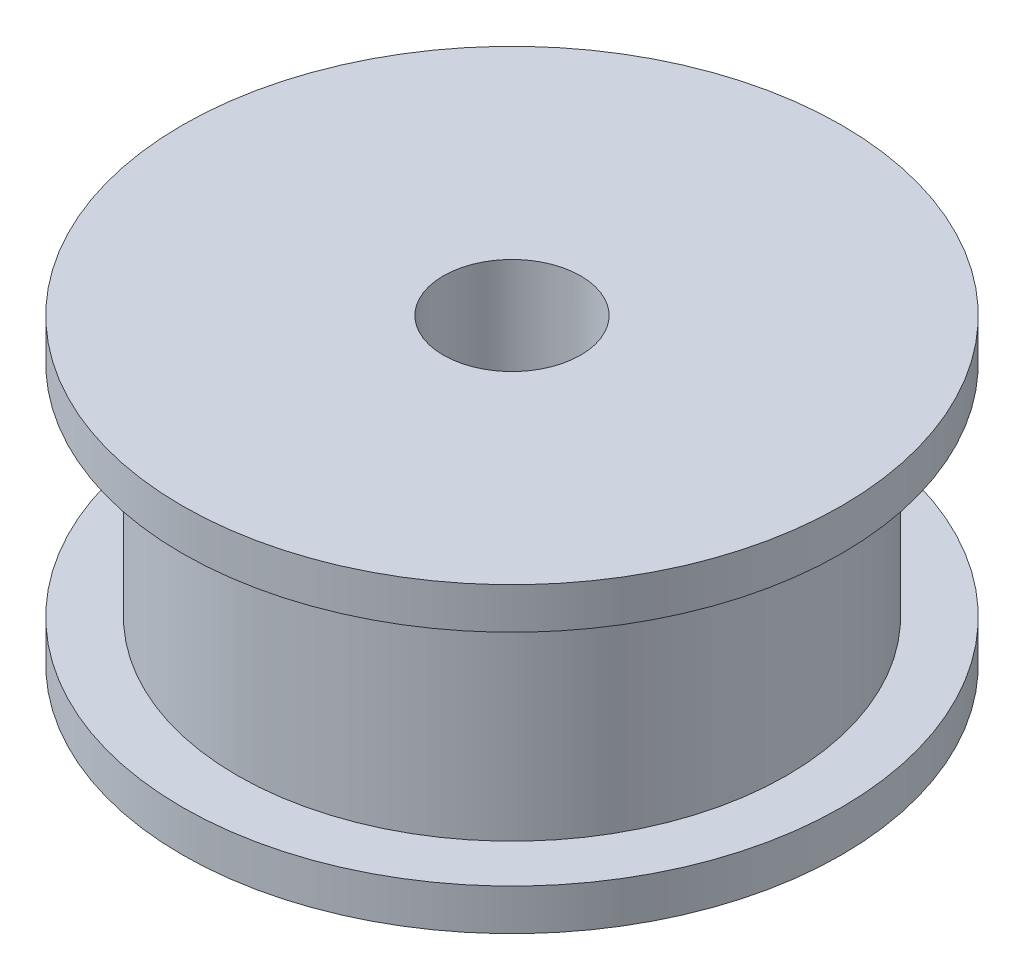
ISO-10303-21;
HEADER;
FILE_DESCRIPTION(('STEP AP214'),'2;1');
FILE_NAME('part.step','',(''),(''),'','','');
FILE_SCHEMA(('AUTOMOTIVE_DESIGN { 1 0 10303 214 1 1 1 1 }'));
ENDSEC;
DATA;
#1=APPLICATION_CONTEXT('core data for automotive mechanical design processes');
#2=APPLICATION_PROTOCOL_DEFINITION('international standard','automotive_design',2000,#1);
#3=PRODUCT_CONTEXT('',#1,'mechanical');
#4=PRODUCT('Part','Part','',(#3));
#5=PRODUCT_RELATED_PRODUCT_CATEGORY('part','',(#4));
#6=PRODUCT_DEFINITION_FORMATION('','',#4);
#7=PRODUCT_DEFINITION_CONTEXT('part definition',#1,'design');
#8=PRODUCT_DEFINITION('design','',#6,#7);
#9=PRODUCT_DEFINITION_SHAPE('','',#8);
#10=(LENGTH_UNIT() NAMED_UNIT(*) SI_UNIT(.MILLI.,.METRE.));
#11=(NAMED_UNIT(*) PLANE_ANGLE_UNIT() SI_UNIT($,.RADIAN.));
#12=(NAMED_UNIT(*) SI_UNIT($,.STERADIAN.) SOLID_ANGLE_UNIT());
#13=UNCERTAINTY_MEASURE_WITH_UNIT(LENGTH_MEASURE(1.E-05),#10,'distance_accuracy_value','');
#14=(GEOMETRIC_REPRESENTATION_CONTEXT(3) GLOBAL_UNCERTAINTY_ASSIGNED_CONTEXT((#13)) GLOBAL_UNIT_ASSIGNED_CONTEXT((#10,
#11,#12)) REPRESENTATION_CONTEXT('',''));
#15=CARTESIAN_POINT('',(0.,0.,0.));
#16=DIRECTION('',(0.,0.,1.));
#17=DIRECTION('',(1.,0.,0.));
#18=AXIS2_PLACEMENT_3D('',#15,#16,#17);
#19=CARTESIAN_POINT('',(0.,16.,0.));
#20=DIRECTION('',(0.,-1.,0.));
#21=DIRECTION('',(0.,0.,-1.));
#22=AXIS2_PLACEMENT_3D('',#19,#20,#21);
#23=CYLINDRICAL_SURFACE('',#22,20.);
#24=CARTESIAN_POINT('',(0.,16.,0.));
#25=DIRECTION('',(0.,1.,0.));
#26=DIRECTION('',(0.,0.,1.));
#27=AXIS2_PLACEMENT_3D('',#24,#25,#26);
#28=CIRCLE('',#27,20.);
#29=CARTESIAN_POINT('',(0.,16.,20.));
#30=VERTEX_POINT('',#29);
#31=EDGE_CURVE('E10',#30,#30,#28,.T.);
#32=ORIENTED_EDGE('',*,*,#31,.F.);
#33=EDGE_LOOP('',(#32));
#34=FACE_BOUND('',#33,.T.);
#35=CARTESIAN_POINT('',(0.,0.,0.));
#36=DIRECTION('',(0.,1.,0.));
#37=DIRECTION('',(0.,0.,1.));
#38=AXIS2_PLACEMENT_3D('',#35,#36,#37);
#39=CIRCLE('',#38,20.);
#40=CARTESIAN_POINT('',(0.,0.,20.));
#41=VERTEX_POINT('',#40);
#42=EDGE_CURVE('E35',#41,#41,#39,.T.);
#43=ORIENTED_EDGE('',*,*,#42,.T.);
#44=EDGE_LOOP('',(#43));
#45=FACE_BOUND('',#44,.T.);
#46=ADVANCED_FACE('F32',(#34,#45),#23,.T.);
#47=CARTESIAN_POINT('',(0.,16.,0.));
#48=DIRECTION('',(0.,-1.,0.));
#49=DIRECTION('',(0.,0.,-1.));
#50=AXIS2_PLACEMENT_3D('',#47,#48,#49);
#51=CYLINDRICAL_SURFACE('',#50,5.);
#52=CARTESIAN_POINT('',(0.,-3.,0.));
#53=DIRECTION('',(0.,-1.,0.));
#54=DIRECTION('',(0.,0.,-1.));
#55=AXIS2_PLACEMENT_3D('',#52,#53,#54);
#56=CIRCLE('',#55,5.);
#57=CARTESIAN_POINT('',(0.,-3.,-5.));
#58=VERTEX_POINT('',#57);
#59=EDGE_CURVE('E47',#58,#58,#56,.T.);
#60=ORIENTED_EDGE('',*,*,#59,.T.);
#61=EDGE_LOOP('',(#60));
#62=FACE_BOUND('',#61,.T.);
#63=CARTESIAN_POINT('',(0.,19.,0.));
#64=DIRECTION('',(0.,1.,0.));
#65=DIRECTION('',(0.,0.,1.));
#66=AXIS2_PLACEMENT_3D('',#63,#64,#65);
#67=CIRCLE('',#66,5.);
#68=CARTESIAN_POINT('',(0.,19.,5.));
#69=VERTEX_POINT('',#68);
#70=EDGE_CURVE('E56',#69,#69,#67,.T.);
#71=ORIENTED_EDGE('',*,*,#70,.T.);
#72=EDGE_LOOP('',(#71));
#73=FACE_BOUND('',#72,.T.);
#74=ADVANCED_FACE('F62',(#62,#73),#51,.F.);
#75=CARTESIAN_POINT('',(0.,-3.,0.));
#76=DIRECTION('',(0.,-1.,0.));
#77=DIRECTION('',(0.,0.,-1.));
#78=AXIS2_PLACEMENT_3D('',#75,#76,#77);
#79=PLANE('',#78);
#80=CARTESIAN_POINT('',(0.,-3.,0.));
#81=DIRECTION('',(0.,-1.,0.));
#82=DIRECTION('',(0.,0.,-1.));
#83=AXIS2_PLACEMENT_3D('',#80,#81,#82);
#84=CIRCLE('',#83,24.);
#85=CARTESIAN_POINT('',(0.,-3.,-24.));
#86=VERTEX_POINT('',#85);
#87=EDGE_CURVE('E42',#86,#86,#84,.T.);
#88=ORIENTED_EDGE('',*,*,#87,.T.);
#89=EDGE_LOOP('',(#88));
#90=FACE_BOUND('',#89,.T.);
#91=ORIENTED_EDGE('',*,*,#59,.F.);
#92=EDGE_LOOP('',(#91));
#93=FACE_BOUND('',#92,.T.);
#94=ADVANCED_FACE('F84',(#90,#93),#79,.T.);
#95=CARTESIAN_POINT('',(0.,0.,0.));
#96=DIRECTION('',(0.,-1.,0.));
#97=DIRECTION('',(0.,0.,-1.));
#98=AXIS2_PLACEMENT_3D('',#95,#96,#97);
#99=PLANE('',#98);
#100=ORIENTED_EDGE('',*,*,#42,.F.);
#101=EDGE_LOOP('',(#100));
#102=FACE_BOUND('',#101,.T.);
#103=CARTESIAN_POINT('',(0.,0.,0.));
#104=DIRECTION('',(0.,-1.,0.));
#105=DIRECTION('',(0.,0.,-1.));
#106=AXIS2_PLACEMENT_3D('',#103,#104,#105);
#107=CIRCLE('',#106,24.);
#108=CARTESIAN_POINT('',(0.,0.,-24.));
#109=VERTEX_POINT('',#108);
#110=EDGE_CURVE('E44',#109,#109,#107,.T.);
#111=ORIENTED_EDGE('',*,*,#110,.F.);
#112=EDGE_LOOP('',(#111));
#113=FACE_BOUND('',#112,.T.);
#114=ADVANCED_FACE('F76',(#102,#113),#99,.F.);
#115=CARTESIAN_POINT('',(0.,-3.,0.));
#116=DIRECTION('',(0.,1.,0.));
#117=DIRECTION('',(0.,0.,1.));
#118=AXIS2_PLACEMENT_3D('',#115,#116,#117);
#119=CYLINDRICAL_SURFACE('',#118,24.);
#120=ORIENTED_EDGE('',*,*,#87,.F.);
#121=EDGE_LOOP('',(#120));
#122=FACE_BOUND('',#121,.T.);
#123=ORIENTED_EDGE('',*,*,#110,.T.);
#124=EDGE_LOOP('',(#123));
#125=FACE_BOUND('',#124,.T.);
#126=ADVANCED_FACE('F67',(#122,#125),#119,.T.);
#127=CARTESIAN_POINT('',(0.,19.,0.));
#128=DIRECTION('',(0.,1.,0.));
#129=DIRECTION('',(0.,0.,1.));
#130=AXIS2_PLACEMENT_3D('',#127,#128,#129);
#131=PLANE('',#130);
#132=CARTESIAN_POINT('',(0.,19.,0.));
#133=DIRECTION('',(0.,1.,0.));
#134=DIRECTION('',(0.,0.,1.));
#135=AXIS2_PLACEMENT_3D('',#132,#133,#134);
#136=CIRCLE('',#135,24.);
#137=CARTESIAN_POINT('',(0.,19.,24.));
#138=VERTEX_POINT('',#137);
#139=EDGE_CURVE('E52',#138,#138,#136,.T.);
#140=ORIENTED_EDGE('',*,*,#139,.T.);
#141=EDGE_LOOP('',(#140));
#142=FACE_BOUND('',#141,.T.);
#143=ORIENTED_EDGE('',*,*,#70,.F.);
#144=EDGE_LOOP('',(#143));
#145=FACE_BOUND('',#144,.T.);
#146=ADVANCED_FACE('F64',(#142,#145),#131,.T.);
#147=CARTESIAN_POINT('',(0.,16.,0.));
#148=DIRECTION('',(0.,1.,0.));
#149=DIRECTION('',(0.,0.,1.));
#150=AXIS2_PLACEMENT_3D('',#147,#148,#149);
#151=PLANE('',#150);
#152=ORIENTED_EDGE('',*,*,#31,.T.);
#153=EDGE_LOOP('',(#152));
#154=FACE_BOUND('',#153,.T.);
#155=CARTESIAN_POINT('',(0.,16.,0.));
#156=DIRECTION('',(0.,1.,0.));
#157=DIRECTION('',(0.,0.,1.));
#158=AXIS2_PLACEMENT_3D('',#155,#156,#157);
#159=CIRCLE('',#158,24.);
#160=CARTESIAN_POINT('',(0.,16.,24.));
#161=VERTEX_POINT('',#160);
#162=EDGE_CURVE('E53',#161,#161,#159,.T.);
#163=ORIENTED_EDGE('',*,*,#162,.F.);
#164=EDGE_LOOP('',(#163));
#165=FACE_BOUND('',#164,.T.);
#166=ADVANCED_FACE('F66',(#154,#165),#151,.F.);
#167=CARTESIAN_POINT('',(0.,19.,0.));
#168=DIRECTION('',(0.,-1.,0.));
#169=DIRECTION('',(0.,0.,-1.));
#170=AXIS2_PLACEMENT_3D('',#167,#168,#169);
#171=CYLINDRICAL_SURFACE('',#170,24.);
#172=ORIENTED_EDGE('',*,*,#139,.F.);
#173=EDGE_LOOP('',(#172));
#174=FACE_BOUND('',#173,.T.);
#175=ORIENTED_EDGE('',*,*,#162,.T.);
#176=EDGE_LOOP('',(#175));
#177=FACE_BOUND('',#176,.T.);
#178=ADVANCED_FACE('F74',(#174,#177),#171,.T.);
#179=CLOSED_SHELL('',(#46,#74,#94,#114,#126,#146,#166,#178));
#180=MANIFOLD_SOLID_BREP('B2',#179);
#181=ADVANCED_BREP_SHAPE_REPRESENTATION('',(#18,#180),#14);
#182=SHAPE_DEFINITION_REPRESENTATION(#9,#181);
ENDSEC;
END-ISO-10303-21;
